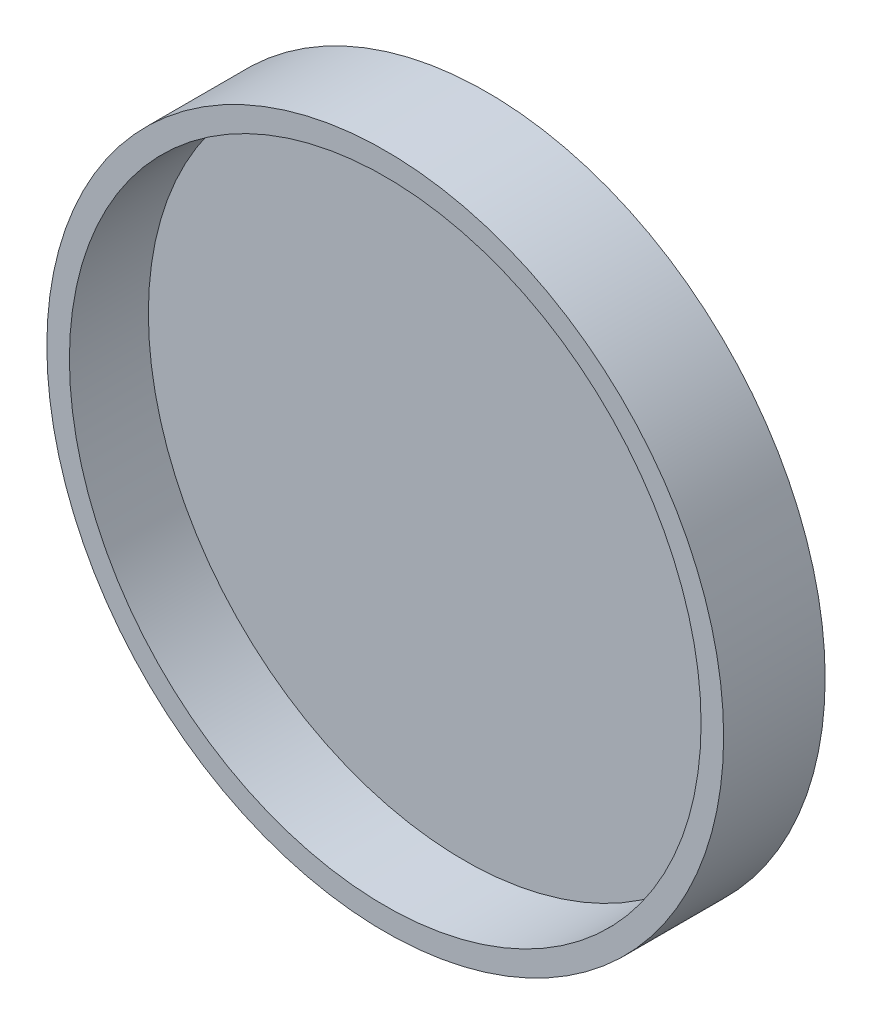
ISO-10303-21;
HEADER;
FILE_DESCRIPTION(('STEP AP214'),'2;1');
FILE_NAME('part.step','',(''),(''),'','','');
FILE_SCHEMA(('AUTOMOTIVE_DESIGN { 1 0 10303 214 1 1 1 1 }'));
ENDSEC;
DATA;
#1=APPLICATION_CONTEXT('core data for automotive mechanical design processes');
#2=APPLICATION_PROTOCOL_DEFINITION('international standard','automotive_design',2000,#1);
#3=PRODUCT_CONTEXT('',#1,'mechanical');
#4=PRODUCT('Part','Part','',(#3));
#5=PRODUCT_RELATED_PRODUCT_CATEGORY('part','',(#4));
#6=PRODUCT_DEFINITION_FORMATION('','',#4);
#7=PRODUCT_DEFINITION_CONTEXT('part definition',#1,'design');
#8=PRODUCT_DEFINITION('design','',#6,#7);
#9=PRODUCT_DEFINITION_SHAPE('','',#8);
#10=(LENGTH_UNIT() NAMED_UNIT(*) SI_UNIT(.MILLI.,.METRE.));
#11=(NAMED_UNIT(*) PLANE_ANGLE_UNIT() SI_UNIT($,.RADIAN.));
#12=(NAMED_UNIT(*) SI_UNIT($,.STERADIAN.) SOLID_ANGLE_UNIT());
#13=UNCERTAINTY_MEASURE_WITH_UNIT(LENGTH_MEASURE(1.E-05),#10,'distance_accuracy_value','');
#14=(GEOMETRIC_REPRESENTATION_CONTEXT(3) GLOBAL_UNCERTAINTY_ASSIGNED_CONTEXT((#13)) GLOBAL_UNIT_ASSIGNED_CONTEXT((#10,
#11,#12)) REPRESENTATION_CONTEXT('',''));
#15=CARTESIAN_POINT('',(0.,0.,0.));
#16=DIRECTION('',(0.,0.,1.));
#17=DIRECTION('',(1.,0.,0.));
#18=AXIS2_PLACEMENT_3D('',#15,#16,#17);
#19=CARTESIAN_POINT('',(0.,0.,4.5));
#20=DIRECTION('',(0.,0.,-1.));
#21=DIRECTION('',(-1.,0.,0.));
#22=AXIS2_PLACEMENT_3D('',#19,#20,#21);
#23=CYLINDRICAL_SURFACE('',#22,15.);
#24=CARTESIAN_POINT('',(0.,0.,4.5));
#25=DIRECTION('',(0.,0.,1.));
#26=DIRECTION('',(1.,0.,0.));
#27=AXIS2_PLACEMENT_3D('',#24,#25,#26);
#28=CIRCLE('',#27,15.);
#29=CARTESIAN_POINT('',(15.,0.,4.5));
#30=VERTEX_POINT('',#29);
#31=EDGE_CURVE('E11',#30,#30,#28,.T.);
#32=ORIENTED_EDGE('',*,*,#31,.F.);
#33=EDGE_LOOP('',(#32));
#34=FACE_BOUND('',#33,.T.);
#35=CARTESIAN_POINT('',(0.,0.,0.));
#36=DIRECTION('',(0.,0.,1.));
#37=DIRECTION('',(1.,0.,0.));
#38=AXIS2_PLACEMENT_3D('',#35,#36,#37);
#39=CIRCLE('',#38,15.);
#40=CARTESIAN_POINT('',(15.,0.,0.));
#41=VERTEX_POINT('',#40);
#42=EDGE_CURVE('E36',#41,#41,#39,.T.);
#43=ORIENTED_EDGE('',*,*,#42,.T.);
#44=EDGE_LOOP('',(#43));
#45=FACE_BOUND('',#44,.T.);
#46=ADVANCED_FACE('F33',(#34,#45),#23,.T.);
#47=CARTESIAN_POINT('',(0.,0.,4.5));
#48=DIRECTION('',(0.,0.,1.));
#49=DIRECTION('',(1.,0.,0.));
#50=AXIS2_PLACEMENT_3D('',#47,#48,#49);
#51=PLANE('',#50);
#52=CARTESIAN_POINT('',(0.,0.,4.5));
#53=DIRECTION('',(0.,0.,1.));
#54=DIRECTION('',(1.,0.,0.));
#55=AXIS2_PLACEMENT_3D('',#52,#53,#54);
#56=CIRCLE('',#55,14.);
#57=CARTESIAN_POINT('',(14.,0.,4.5));
#58=VERTEX_POINT('',#57);
#59=EDGE_CURVE('E47',#58,#58,#56,.T.);
#60=ORIENTED_EDGE('',*,*,#59,.F.);
#61=EDGE_LOOP('',(#60));
#62=FACE_BOUND('',#61,.T.);
#63=ORIENTED_EDGE('',*,*,#31,.T.);
#64=EDGE_LOOP('',(#63));
#65=FACE_BOUND('',#64,.T.);
#66=ADVANCED_FACE('F53',(#62,#65),#51,.T.);
#67=CARTESIAN_POINT('',(0.,0.,0.));
#68=DIRECTION('',(0.,0.,1.));
#69=DIRECTION('',(1.,0.,0.));
#70=AXIS2_PLACEMENT_3D('',#67,#68,#69);
#71=PLANE('',#70);
#72=ORIENTED_EDGE('',*,*,#42,.F.);
#73=EDGE_LOOP('',(#72));
#74=FACE_BOUND('',#73,.T.);
#75=ADVANCED_FACE('F55',(#74),#71,.F.);
#76=CARTESIAN_POINT('',(0.,0.,-39.5979797464467));
#77=DIRECTION('',(0.,0.,1.));
#78=DIRECTION('',(1.,0.,0.));
#79=AXIS2_PLACEMENT_3D('',#76,#77,#78);
#80=CYLINDRICAL_SURFACE('',#79,14.);
#81=CARTESIAN_POINT('',(0.,0.,1.));
#82=DIRECTION('',(0.,0.,1.));
#83=DIRECTION('',(1.,0.,0.));
#84=AXIS2_PLACEMENT_3D('',#81,#82,#83);
#85=CIRCLE('',#84,14.);
#86=CARTESIAN_POINT('',(14.,0.,1.));
#87=VERTEX_POINT('',#86);
#88=EDGE_CURVE('E43',#87,#87,#85,.F.);
#89=ORIENTED_EDGE('',*,*,#88,.T.);
#90=EDGE_LOOP('',(#89));
#91=FACE_BOUND('',#90,.T.);
#92=ORIENTED_EDGE('',*,*,#59,.T.);
#93=EDGE_LOOP('',(#92));
#94=FACE_BOUND('',#93,.T.);
#95=ADVANCED_FACE('F51',(#91,#94),#80,.F.);
#96=CARTESIAN_POINT('',(0.,0.,1.));
#97=DIRECTION('',(0.,0.,1.));
#98=DIRECTION('',(1.,0.,0.));
#99=AXIS2_PLACEMENT_3D('',#96,#97,#98);
#100=PLANE('',#99);
#101=ORIENTED_EDGE('',*,*,#88,.F.);
#102=EDGE_LOOP('',(#101));
#103=FACE_BOUND('',#102,.T.);
#104=ADVANCED_FACE('F66',(#103),#100,.T.);
#105=CLOSED_SHELL('',(#46,#66,#75,#95,#104));
#106=MANIFOLD_SOLID_BREP('B2',#105);
#107=ADVANCED_BREP_SHAPE_REPRESENTATION('',(#18,#106),#14);
#108=SHAPE_DEFINITION_REPRESENTATION(#9,#107);
ENDSEC;
END-ISO-10303-21;
